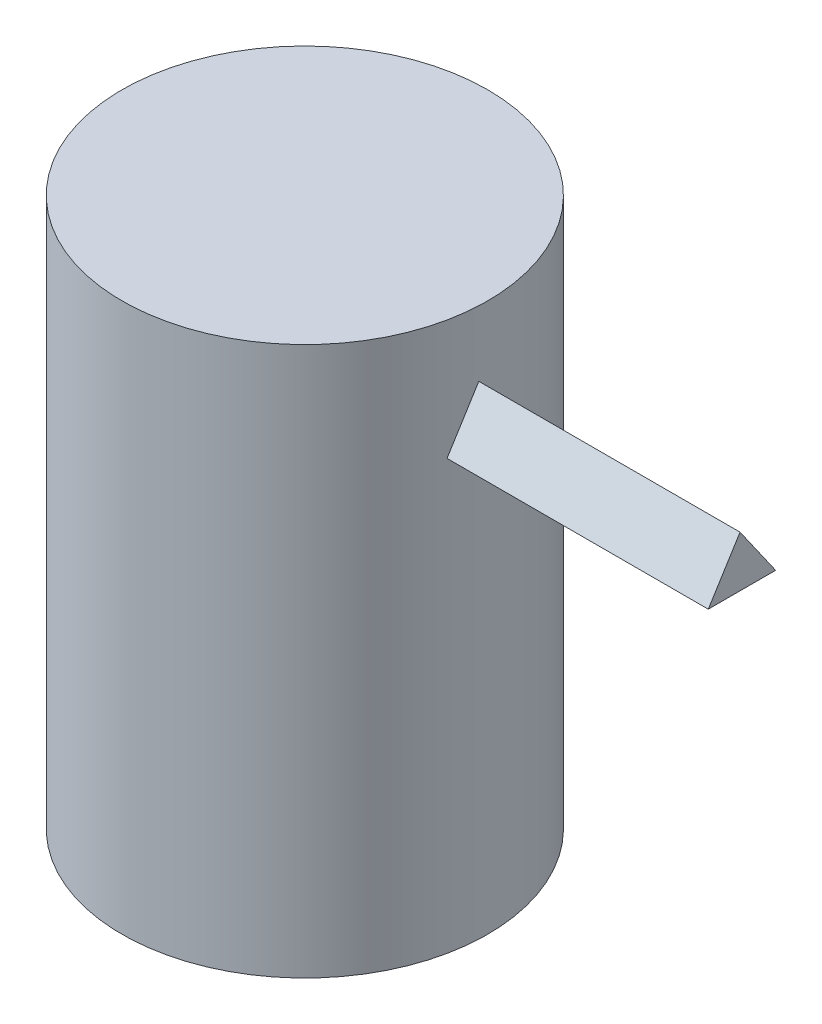
ISO-10303-21;
HEADER;
FILE_DESCRIPTION(('STEP AP214'),'2;1');
FILE_NAME('part.step','',(''),(''),'','','');
FILE_SCHEMA(('AUTOMOTIVE_DESIGN { 1 0 10303 214 1 1 1 1 }'));
ENDSEC;
DATA;
#1=APPLICATION_CONTEXT('core data for automotive mechanical design processes');
#2=APPLICATION_PROTOCOL_DEFINITION('international standard','automotive_design',2000,#1);
#3=PRODUCT_CONTEXT('',#1,'mechanical');
#4=PRODUCT('Part','Part','',(#3));
#5=PRODUCT_RELATED_PRODUCT_CATEGORY('part','',(#4));
#6=PRODUCT_DEFINITION_FORMATION('','',#4);
#7=PRODUCT_DEFINITION_CONTEXT('part definition',#1,'design');
#8=PRODUCT_DEFINITION('design','',#6,#7);
#9=PRODUCT_DEFINITION_SHAPE('','',#8);
#10=(LENGTH_UNIT() NAMED_UNIT(*) SI_UNIT(.MILLI.,.METRE.));
#11=(NAMED_UNIT(*) PLANE_ANGLE_UNIT() SI_UNIT($,.RADIAN.));
#12=(NAMED_UNIT(*) SI_UNIT($,.STERADIAN.) SOLID_ANGLE_UNIT());
#13=UNCERTAINTY_MEASURE_WITH_UNIT(LENGTH_MEASURE(1.E-05),#10,'distance_accuracy_value','');
#14=(GEOMETRIC_REPRESENTATION_CONTEXT(3) GLOBAL_UNCERTAINTY_ASSIGNED_CONTEXT((#13)) GLOBAL_UNIT_ASSIGNED_CONTEXT((#10,
#11,#12)) REPRESENTATION_CONTEXT('',''));
#15=CARTESIAN_POINT('',(0.,0.,0.));
#16=DIRECTION('',(0.,0.,1.));
#17=DIRECTION('',(1.,0.,0.));
#18=AXIS2_PLACEMENT_3D('',#15,#16,#17);
#19=CARTESIAN_POINT('',(17.,16.5574713966216,-1.02174216328556));
#20=DIRECTION('',(0.,-0.573462344363329,0.81923192051904));
#21=DIRECTION('',(0.,-0.81923192051904,-0.573462344363329));
#22=AXIS2_PLACEMENT_3D('',#19,#20,#21);
#23=PLANE('',#22);
#24=DIRECTION('',(0.,0.81923192051904,0.573462344363329));
#25=VECTOR('',#24,1.);
#26=CARTESIAN_POINT('',(7.,16.5574713966216,-1.02174216328556));
#27=LINE('',#26,#25);
#28=CARTESIAN_POINT('',(7.,16.5574713966216,-1.02174216328556));
#29=VERTEX_POINT('',#28);
#30=CARTESIAN_POINT('',(7.,18.5036469457369,0.340580721095191));
#31=VERTEX_POINT('',#30);
#32=EDGE_CURVE('E90',#29,#31,#27,.T.);
#33=ORIENTED_EDGE('',*,*,#32,.T.);
#34=DIRECTION('',(-1.,0.,0.));
#35=VECTOR('',#34,1.);
#36=CARTESIAN_POINT('',(17.,18.5036469457369,0.340580721095191));
#37=LINE('',#36,#35);
#38=CARTESIAN_POINT('',(17.,18.5036469457369,0.340580721095191));
#39=VERTEX_POINT('',#38);
#40=EDGE_CURVE('E12',#39,#31,#37,.T.);
#41=ORIENTED_EDGE('',*,*,#40,.F.);
#42=DIRECTION('',(0.,0.81923192051904,0.573462344363329));
#43=VECTOR('',#42,1.);
#44=CARTESIAN_POINT('',(17.,16.5574713966216,-1.02174216328556));
#45=LINE('',#44,#43);
#46=CARTESIAN_POINT('',(17.,16.5574713966216,-1.02174216328556));
#47=VERTEX_POINT('',#46);
#48=EDGE_CURVE('E83',#47,#39,#45,.T.);
#49=ORIENTED_EDGE('',*,*,#48,.F.);
#50=DIRECTION('',(-1.,0.,0.));
#51=VECTOR('',#50,1.);
#52=CARTESIAN_POINT('',(17.,16.5574713966216,-1.02174216328556));
#53=LINE('',#52,#51);
#54=EDGE_CURVE('E91',#47,#29,#53,.T.);
#55=ORIENTED_EDGE('',*,*,#54,.T.);
#56=EDGE_LOOP('',(#33,#41,#49,#55));
#57=FACE_BOUND('',#56,.T.);
#58=ADVANCED_FACE('F43',(#57),#23,.F.);
#59=CARTESIAN_POINT('',(17.,18.5036469457369,0.340580721095191));
#60=DIRECTION('',(0.,-0.529998940003179,-0.847998304005088));
#61=DIRECTION('',(0.,0.847998304005088,-0.529998940003179));
#62=AXIS2_PLACEMENT_3D('',#59,#60,#61);
#63=PLANE('',#62);
#64=DIRECTION('',(0.,-0.847998304005089,0.529998940003179));
#65=VECTOR('',#64,1.);
#66=CARTESIAN_POINT('',(7.,18.5036469457369,0.340580721095191));
#67=LINE('',#66,#65);
#68=CARTESIAN_POINT('',(7.,16.5574713966216,1.55694043929228));
#69=VERTEX_POINT('',#68);
#70=EDGE_CURVE('E71',#31,#69,#67,.T.);
#71=ORIENTED_EDGE('',*,*,#70,.T.);
#72=DIRECTION('',(-1.,0.,0.));
#73=VECTOR('',#72,1.);
#74=CARTESIAN_POINT('',(17.,16.5574713966216,1.55694043929228));
#75=LINE('',#74,#73);
#76=CARTESIAN_POINT('',(17.,16.5574713966216,1.55694043929228));
#77=VERTEX_POINT('',#76);
#78=EDGE_CURVE('E51',#77,#69,#75,.T.);
#79=ORIENTED_EDGE('',*,*,#78,.F.);
#80=DIRECTION('',(0.,-0.847998304005089,0.529998940003179));
#81=VECTOR('',#80,1.);
#82=CARTESIAN_POINT('',(17.,18.5036469457369,0.340580721095191));
#83=LINE('',#82,#81);
#84=EDGE_CURVE('E79',#39,#77,#83,.T.);
#85=ORIENTED_EDGE('',*,*,#84,.F.);
#86=ORIENTED_EDGE('',*,*,#40,.T.);
#87=EDGE_LOOP('',(#71,#79,#85,#86));
#88=FACE_BOUND('',#87,.T.);
#89=ADVANCED_FACE('F80',(#88),#63,.F.);
#90=CARTESIAN_POINT('',(17.,16.5574713966216,1.55694043929228));
#91=DIRECTION('',(0.,1.,0.));
#92=DIRECTION('',(0.,0.,1.));
#93=AXIS2_PLACEMENT_3D('',#90,#91,#92);
#94=PLANE('',#93);
#95=DIRECTION('',(0.,0.,-1.));
#96=VECTOR('',#95,1.);
#97=CARTESIAN_POINT('',(7.,16.5574713966216,1.55694043929228));
#98=LINE('',#97,#96);
#99=EDGE_CURVE('E76',#69,#29,#98,.T.);
#100=ORIENTED_EDGE('',*,*,#99,.T.);
#101=ORIENTED_EDGE('',*,*,#54,.F.);
#102=DIRECTION('',(0.,0.,-1.));
#103=VECTOR('',#102,1.);
#104=CARTESIAN_POINT('',(17.,16.5574713966216,1.55694043929228));
#105=LINE('',#104,#103);
#106=EDGE_CURVE('E59',#77,#47,#105,.T.);
#107=ORIENTED_EDGE('',*,*,#106,.F.);
#108=ORIENTED_EDGE('',*,*,#78,.T.);
#109=EDGE_LOOP('',(#100,#101,#107,#108));
#110=FACE_BOUND('',#109,.T.);
#111=ADVANCED_FACE('F98',(#110),#94,.F.);
#112=CARTESIAN_POINT('',(17.,0.,0.));
#113=DIRECTION('',(1.,0.,0.));
#114=DIRECTION('',(0.,0.,-1.));
#115=AXIS2_PLACEMENT_3D('',#112,#113,#114);
#116=PLANE('',#115);
#117=ORIENTED_EDGE('',*,*,#48,.T.);
#118=ORIENTED_EDGE('',*,*,#84,.T.);
#119=ORIENTED_EDGE('',*,*,#106,.T.);
#120=EDGE_LOOP('',(#117,#118,#119));
#121=FACE_BOUND('',#120,.T.);
#122=ADVANCED_FACE('F86',(#121),#116,.T.);
#123=CARTESIAN_POINT('',(7.,0.,0.));
#124=DIRECTION('',(1.,0.,0.));
#125=DIRECTION('',(0.,0.,-1.));
#126=AXIS2_PLACEMENT_3D('',#123,#124,#125);
#127=PLANE('',#126);
#128=ORIENTED_EDGE('',*,*,#32,.F.);
#129=ORIENTED_EDGE('',*,*,#99,.F.);
#130=ORIENTED_EDGE('',*,*,#70,.F.);
#131=EDGE_LOOP('',(#128,#129,#130));
#132=FACE_BOUND('',#131,.T.);
#133=ADVANCED_FACE('F99',(#132),#127,.F.);
#134=CLOSED_SHELL('',(#58,#89,#111,#122,#133));
#135=MANIFOLD_SOLID_BREP('B2',#134);
#136=CARTESIAN_POINT('',(0.,21.,0.));
#137=DIRECTION('',(0.,-1.,0.));
#138=DIRECTION('',(0.,0.,-1.));
#139=AXIS2_PLACEMENT_3D('',#136,#137,#138);
#140=CYLINDRICAL_SURFACE('',#139,7.);
#141=CARTESIAN_POINT('',(0.,21.,0.));
#142=DIRECTION('',(0.,1.,0.));
#143=DIRECTION('',(0.,0.,1.));
#144=AXIS2_PLACEMENT_3D('',#141,#142,#143);
#145=CIRCLE('',#144,7.);
#146=CARTESIAN_POINT('',(0.,21.,-7.));
#147=VERTEX_POINT('',#146);
#148=EDGE_CURVE('E42',#147,#147,#145,.T.);
#149=CARTESIAN_POINT('',(0.,0.,0.));
#150=DIRECTION('',(0.,1.,0.));
#151=DIRECTION('',(0.,0.,1.));
#152=AXIS2_PLACEMENT_3D('',#149,#150,#151);
#153=CIRCLE('',#152,7.);
#154=CARTESIAN_POINT('',(0.,0.,-7.));
#155=VERTEX_POINT('',#154);
#156=EDGE_CURVE('E144',#155,#155,#153,.T.);
#157=CARTESIAN_POINT('',(0.,21.,-7.));
#158=CARTESIAN_POINT('',(0.,20.78125,-7.));
#159=CARTESIAN_POINT('',(0.,20.5625,-7.));
#160=CARTESIAN_POINT('',(0.,20.125,-7.));
#161=CARTESIAN_POINT('',(0.,19.90625,-7.));
#162=CARTESIAN_POINT('',(0.,19.46875,-7.));
#163=CARTESIAN_POINT('',(0.,19.25,-7.));
#164=CARTESIAN_POINT('',(0.,18.8125,-7.));
#165=CARTESIAN_POINT('',(0.,18.59375,-7.));
#166=CARTESIAN_POINT('',(0.,18.15625,-7.));
#167=CARTESIAN_POINT('',(0.,17.9375,-7.));
#168=CARTESIAN_POINT('',(0.,17.5,-7.));
#169=CARTESIAN_POINT('',(0.,17.28125,-7.));
#170=CARTESIAN_POINT('',(0.,16.84375,-7.));
#171=CARTESIAN_POINT('',(0.,16.625,-7.));
#172=CARTESIAN_POINT('',(0.,16.1875,-7.));
#173=CARTESIAN_POINT('',(0.,15.96875,-7.));
#174=CARTESIAN_POINT('',(0.,15.53125,-7.));
#175=CARTESIAN_POINT('',(0.,15.3125,-7.));
#176=CARTESIAN_POINT('',(0.,14.875,-7.));
#177=CARTESIAN_POINT('',(0.,14.65625,-7.));
#178=CARTESIAN_POINT('',(0.,14.21875,-7.));
#179=CARTESIAN_POINT('',(0.,14.,-7.));
#180=CARTESIAN_POINT('',(0.,13.5625,-7.));
#181=CARTESIAN_POINT('',(0.,13.34375,-7.));
#182=CARTESIAN_POINT('',(0.,12.90625,-7.));
#183=CARTESIAN_POINT('',(0.,12.6875,-7.));
#184=CARTESIAN_POINT('',(0.,12.25,-7.));
#185=CARTESIAN_POINT('',(0.,12.03125,-7.));
#186=CARTESIAN_POINT('',(0.,11.59375,-7.));
#187=CARTESIAN_POINT('',(0.,11.375,-7.));
#188=CARTESIAN_POINT('',(0.,10.9375,-7.));
#189=CARTESIAN_POINT('',(0.,10.71875,-7.));
#190=CARTESIAN_POINT('',(0.,10.28125,-7.));
#191=CARTESIAN_POINT('',(0.,10.0625,-7.));
#192=CARTESIAN_POINT('',(0.,9.625,-7.));
#193=CARTESIAN_POINT('',(0.,9.40625,-7.));
#194=CARTESIAN_POINT('',(0.,8.96875,-7.));
#195=CARTESIAN_POINT('',(0.,8.75,-7.));
#196=CARTESIAN_POINT('',(0.,8.3125,-7.));
#197=CARTESIAN_POINT('',(0.,8.09375,-7.));
#198=CARTESIAN_POINT('',(0.,7.65625,-7.));
#199=CARTESIAN_POINT('',(0.,7.4375,-7.));
#200=CARTESIAN_POINT('',(0.,7.,-7.));
#201=CARTESIAN_POINT('',(0.,6.78125,-7.));
#202=CARTESIAN_POINT('',(0.,6.34375,-7.));
#203=CARTESIAN_POINT('',(0.,6.125,-7.));
#204=CARTESIAN_POINT('',(0.,5.6875,-7.));
#205=CARTESIAN_POINT('',(0.,5.46875,-7.));
#206=CARTESIAN_POINT('',(0.,5.03125,-7.));
#207=CARTESIAN_POINT('',(0.,4.8125,-7.));
#208=CARTESIAN_POINT('',(0.,4.375,-7.));
#209=CARTESIAN_POINT('',(0.,4.15625,-7.));
#210=CARTESIAN_POINT('',(0.,3.71875,-7.));
#211=CARTESIAN_POINT('',(0.,3.5,-7.));
#212=CARTESIAN_POINT('',(0.,3.0625,-7.));
#213=CARTESIAN_POINT('',(0.,2.84375,-7.));
#214=CARTESIAN_POINT('',(0.,2.40625,-7.));
#215=CARTESIAN_POINT('',(0.,2.1875,-7.));
#216=CARTESIAN_POINT('',(0.,1.75,-7.));
#217=CARTESIAN_POINT('',(0.,1.53125,-7.));
#218=CARTESIAN_POINT('',(0.,1.09375,-7.));
#219=CARTESIAN_POINT('',(0.,0.875000000000001,-7.));
#220=CARTESIAN_POINT('',(0.,0.4375,-7.));
#221=CARTESIAN_POINT('',(0.,0.21875,-7.));
#222=CARTESIAN_POINT('',(0.,0.,-7.));
#223=B_SPLINE_CURVE_WITH_KNOTS('',3,(#157,#158,#159,#160,#161,#162,#163,#164,#165,#166,#167,
#168,#169,#170,#171,#172,#173,#174,#175,#176,#177,#178,#179,#180,#181,#182,#183,#184,#185,#186,
#187,#188,#189,#190,#191,#192,#193,#194,#195,#196,#197,#198,#199,#200,#201,#202,#203,#204,#205,
#206,#207,#208,#209,#210,#211,#212,#213,#214,#215,#216,#217,#218,#219,#220,#221,#222),
.UNSPECIFIED.,.F.,.F.,(4,2,2,2,2,2,2,2,2,2,2,2,2,2,2,2,2,2,2,2,2,2,2,2,2,2,2,2,2,2,2,2,4),(0.,
0.656249999999997,1.3125,1.96875,2.625,3.28125,3.9375,4.59375,5.25,5.90625,6.5625,7.21875,7.875,
8.53125,9.1875,9.84375,10.5,11.15625,11.8125,12.46875,13.125,13.78125,14.4375,15.09375,15.75,
16.40625,17.0625,17.71875,18.375,19.03125,19.6875,20.34375,21.),.UNSPECIFIED.);
#224=EDGE_CURVE('BSEAM141',#147,#155,#223,.T.);
#225=ORIENTED_EDGE('',*,*,#148,.F.);
#226=ORIENTED_EDGE('',*,*,#156,.T.);
#227=ORIENTED_EDGE('',*,*,#224,.T.);
#228=ORIENTED_EDGE('',*,*,#224,.F.);
#229=EDGE_LOOP('',(#225,#227,#226,#228));
#230=FACE_BOUND('',#229,.T.);
#231=ADVANCED_FACE('F141',(#230),#140,.T.);
#232=CARTESIAN_POINT('',(0.,21.,0.));
#233=DIRECTION('',(0.,1.,0.));
#234=DIRECTION('',(0.,0.,1.));
#235=AXIS2_PLACEMENT_3D('',#232,#233,#234);
#236=PLANE('',#235);
#237=ORIENTED_EDGE('',*,*,#148,.T.);
#238=EDGE_LOOP('',(#237));
#239=FACE_BOUND('',#238,.T.);
#240=ADVANCED_FACE('F172',(#239),#236,.T.);
#241=CARTESIAN_POINT('',(0.,0.,0.));
#242=DIRECTION('',(0.,1.,0.));
#243=DIRECTION('',(0.,0.,1.));
#244=AXIS2_PLACEMENT_3D('',#241,#242,#243);
#245=PLANE('',#244);
#246=CARTESIAN_POINT('',(0.,0.,0.));
#247=DIRECTION('',(0.,1.,0.));
#248=DIRECTION('',(0.,0.,1.));
#249=AXIS2_PLACEMENT_3D('',#246,#247,#248);
#250=CIRCLE('',#249,6.);
#251=CARTESIAN_POINT('',(0.,0.,-6.));
#252=VERTEX_POINT('',#251);
#253=EDGE_CURVE('E153',#252,#252,#250,.T.);
#254=ORIENTED_EDGE('',*,*,#253,.T.);
#255=EDGE_LOOP('',(#254));
#256=FACE_BOUND('',#255,.T.);
#257=ORIENTED_EDGE('',*,*,#156,.F.);
#258=EDGE_LOOP('',(#257));
#259=FACE_BOUND('',#258,.T.);
#260=ADVANCED_FACE('F168',(#256,#259),#245,.F.);
#261=CARTESIAN_POINT('',(0.,21.,0.));
#262=DIRECTION('',(0.,-1.,0.));
#263=DIRECTION('',(0.,0.,-1.));
#264=AXIS2_PLACEMENT_3D('',#261,#262,#263);
#265=CYLINDRICAL_SURFACE('',#264,6.);
#266=CARTESIAN_POINT('',(0.,20.,0.));
#267=DIRECTION('',(0.,1.,0.));
#268=DIRECTION('',(0.,0.,1.));
#269=AXIS2_PLACEMENT_3D('',#266,#267,#268);
#270=CIRCLE('',#269,6.);
#271=CARTESIAN_POINT('',(0.,20.,-6.));
#272=VERTEX_POINT('',#271);
#273=EDGE_CURVE('E151',#272,#272,#270,.T.);
#274=CARTESIAN_POINT('',(0.,20.,-6.));
#275=CARTESIAN_POINT('',(0.,19.7916666666667,-6.));
#276=CARTESIAN_POINT('',(0.,19.5833333333333,-6.));
#277=CARTESIAN_POINT('',(0.,19.1666666666667,-6.));
#278=CARTESIAN_POINT('',(0.,18.9583333333333,-6.));
#279=CARTESIAN_POINT('',(0.,18.5416666666667,-6.));
#280=CARTESIAN_POINT('',(0.,18.3333333333333,-6.));
#281=CARTESIAN_POINT('',(0.,17.9166666666667,-6.));
#282=CARTESIAN_POINT('',(0.,17.7083333333333,-6.));
#283=CARTESIAN_POINT('',(0.,17.2916666666667,-6.));
#284=CARTESIAN_POINT('',(0.,17.0833333333333,-6.));
#285=CARTESIAN_POINT('',(0.,16.6666666666667,-6.));
#286=CARTESIAN_POINT('',(0.,16.4583333333333,-6.));
#287=CARTESIAN_POINT('',(0.,16.0416666666667,-6.));
#288=CARTESIAN_POINT('',(0.,15.8333333333333,-6.));
#289=CARTESIAN_POINT('',(0.,15.4166666666667,-6.));
#290=CARTESIAN_POINT('',(0.,15.2083333333333,-6.));
#291=CARTESIAN_POINT('',(0.,14.7916666666667,-6.));
#292=CARTESIAN_POINT('',(0.,14.5833333333333,-6.));
#293=CARTESIAN_POINT('',(0.,14.1666666666667,-6.));
#294=CARTESIAN_POINT('',(0.,13.9583333333333,-6.));
#295=CARTESIAN_POINT('',(0.,13.5416666666667,-6.));
#296=CARTESIAN_POINT('',(0.,13.3333333333333,-6.));
#297=CARTESIAN_POINT('',(0.,12.9166666666667,-6.));
#298=CARTESIAN_POINT('',(0.,12.7083333333333,-6.));
#299=CARTESIAN_POINT('',(0.,12.2916666666667,-6.));
#300=CARTESIAN_POINT('',(0.,12.0833333333333,-6.));
#301=CARTESIAN_POINT('',(0.,11.6666666666667,-6.));
#302=CARTESIAN_POINT('',(0.,11.4583333333333,-6.));
#303=CARTESIAN_POINT('',(0.,11.0416666666667,-6.));
#304=CARTESIAN_POINT('',(0.,10.8333333333333,-6.));
#305=CARTESIAN_POINT('',(0.,10.4166666666667,-6.));
#306=CARTESIAN_POINT('',(0.,10.2083333333333,-6.));
#307=CARTESIAN_POINT('',(0.,9.79166666666667,-6.));
#308=CARTESIAN_POINT('',(0.,9.58333333333333,-6.));
#309=CARTESIAN_POINT('',(0.,9.16666666666666,-6.));
#310=CARTESIAN_POINT('',(0.,8.95833333333333,-6.));
#311=CARTESIAN_POINT('',(0.,8.54166666666666,-6.));
#312=CARTESIAN_POINT('',(0.,8.33333333333333,-6.));
#313=CARTESIAN_POINT('',(0.,7.91666666666667,-6.));
#314=CARTESIAN_POINT('',(0.,7.70833333333333,-6.));
#315=CARTESIAN_POINT('',(0.,7.29166666666666,-6.));
#316=CARTESIAN_POINT('',(0.,7.08333333333333,-6.));
#317=CARTESIAN_POINT('',(0.,6.66666666666666,-6.));
#318=CARTESIAN_POINT('',(0.,6.45833333333333,-6.));
#319=CARTESIAN_POINT('',(0.,6.04166666666667,-6.));
#320=CARTESIAN_POINT('',(0.,5.83333333333333,-6.));
#321=CARTESIAN_POINT('',(0.,5.41666666666666,-6.));
#322=CARTESIAN_POINT('',(0.,5.20833333333333,-6.));
#323=CARTESIAN_POINT('',(0.,4.79166666666666,-6.));
#324=CARTESIAN_POINT('',(0.,4.58333333333333,-6.));
#325=CARTESIAN_POINT('',(0.,4.16666666666666,-6.));
#326=CARTESIAN_POINT('',(0.,3.95833333333333,-6.));
#327=CARTESIAN_POINT('',(0.,3.54166666666666,-6.));
#328=CARTESIAN_POINT('',(0.,3.33333333333333,-6.));
#329=CARTESIAN_POINT('',(0.,2.91666666666666,-6.));
#330=CARTESIAN_POINT('',(0.,2.70833333333333,-6.));
#331=CARTESIAN_POINT('',(0.,2.29166666666667,-6.));
#332=CARTESIAN_POINT('',(0.,2.08333333333334,-6.));
#333=CARTESIAN_POINT('',(0.,1.66666666666667,-6.));
#334=CARTESIAN_POINT('',(0.,1.45833333333333,-6.));
#335=CARTESIAN_POINT('',(0.,1.04166666666667,-6.));
#336=CARTESIAN_POINT('',(0.,0.833333333333334,-6.));
#337=CARTESIAN_POINT('',(0.,0.416666666666667,-6.));
#338=CARTESIAN_POINT('',(0.,0.208333333333334,-6.));
#339=CARTESIAN_POINT('',(0.,0.,-6.));
#340=B_SPLINE_CURVE_WITH_KNOTS('',3,(#274,#275,#276,#277,#278,#279,#280,#281,#282,#283,#284,
#285,#286,#287,#288,#289,#290,#291,#292,#293,#294,#295,#296,#297,#298,#299,#300,#301,#302,#303,
#304,#305,#306,#307,#308,#309,#310,#311,#312,#313,#314,#315,#316,#317,#318,#319,#320,#321,#322,
#323,#324,#325,#326,#327,#328,#329,#330,#331,#332,#333,#334,#335,#336,#337,#338,#339),
.UNSPECIFIED.,.F.,.F.,(4,2,2,2,2,2,2,2,2,2,2,2,2,2,2,2,2,2,2,2,2,2,2,2,2,2,2,2,2,2,2,2,4),(0.,
0.625000000000001,1.25,1.875,2.5,3.125,3.75,4.375,5.,5.625,6.25,6.875,7.5,8.125,8.75,9.375,10.,
10.625,11.25,11.875,12.5,13.125,13.75,14.375,15.,15.625,16.25,16.875,17.5,18.125,18.75,19.375,
20.),.UNSPECIFIED.);
#341=EDGE_CURVE('BSEAM159',#272,#252,#340,.T.);
#342=ORIENTED_EDGE('',*,*,#273,.T.);
#343=ORIENTED_EDGE('',*,*,#253,.F.);
#344=ORIENTED_EDGE('',*,*,#341,.T.);
#345=ORIENTED_EDGE('',*,*,#341,.F.);
#346=EDGE_LOOP('',(#342,#344,#343,#345));
#347=FACE_BOUND('',#346,.T.);
#348=ADVANCED_FACE('F159',(#347),#265,.F.);
#349=CARTESIAN_POINT('',(0.,20.,0.));
#350=DIRECTION('',(0.,1.,0.));
#351=DIRECTION('',(0.,0.,1.));
#352=AXIS2_PLACEMENT_3D('',#349,#350,#351);
#353=PLANE('',#352);
#354=ORIENTED_EDGE('',*,*,#273,.F.);
#355=EDGE_LOOP('',(#354));
#356=FACE_BOUND('',#355,.T.);
#357=ADVANCED_FACE('F162',(#356),#353,.F.);
#358=CLOSED_SHELL('',(#231,#240,#260,#348,#357));
#359=MANIFOLD_SOLID_BREP('B6',#358);
#360=ADVANCED_BREP_SHAPE_REPRESENTATION('',(#18,#135,#359),#14);
#361=SHAPE_DEFINITION_REPRESENTATION(#9,#360);
ENDSEC;
END-ISO-10303-21;
